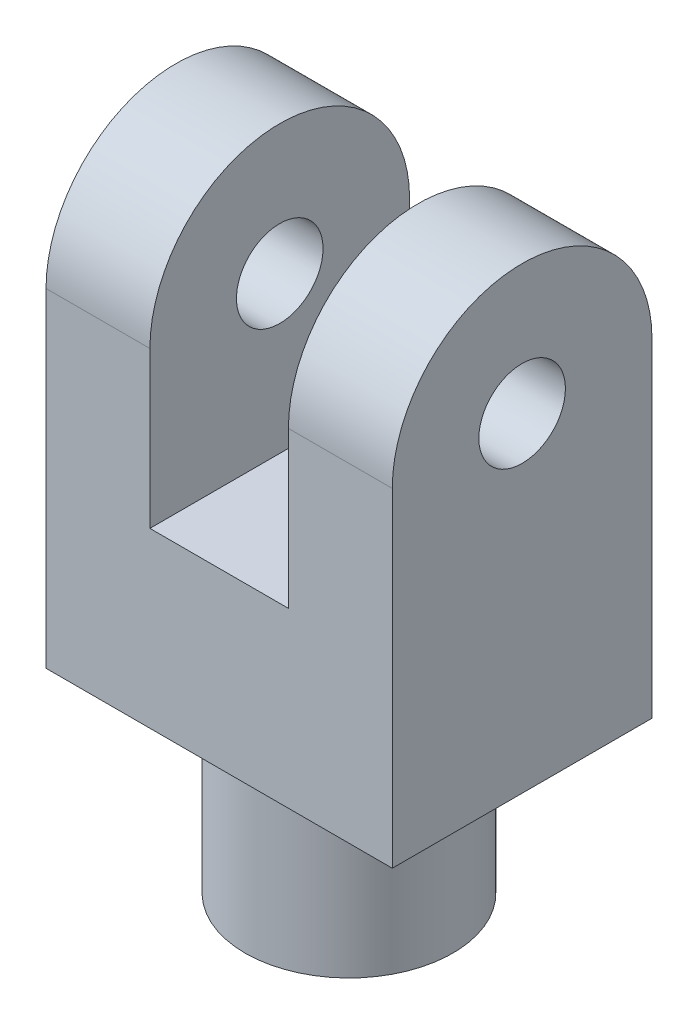
ISO-10303-21;
HEADER;
FILE_DESCRIPTION(('STEP AP214'),'2;1');
FILE_NAME('part.step','',(''),(''),'','','');
FILE_SCHEMA(('AUTOMOTIVE_DESIGN { 1 0 10303 214 1 1 1 1 }'));
ENDSEC;
DATA;
#1=APPLICATION_CONTEXT('core data for automotive mechanical design processes');
#2=APPLICATION_PROTOCOL_DEFINITION('international standard','automotive_design',2000,#1);
#3=PRODUCT_CONTEXT('',#1,'mechanical');
#4=PRODUCT('Part','Part','',(#3));
#5=PRODUCT_RELATED_PRODUCT_CATEGORY('part','',(#4));
#6=PRODUCT_DEFINITION_FORMATION('','',#4);
#7=PRODUCT_DEFINITION_CONTEXT('part definition',#1,'design');
#8=PRODUCT_DEFINITION('design','',#6,#7);
#9=PRODUCT_DEFINITION_SHAPE('','',#8);
#10=(LENGTH_UNIT() NAMED_UNIT(*) SI_UNIT(.MILLI.,.METRE.));
#11=(NAMED_UNIT(*) PLANE_ANGLE_UNIT() SI_UNIT($,.RADIAN.));
#12=(NAMED_UNIT(*) SI_UNIT($,.STERADIAN.) SOLID_ANGLE_UNIT());
#13=UNCERTAINTY_MEASURE_WITH_UNIT(LENGTH_MEASURE(1.E-05),#10,'distance_accuracy_value','');
#14=(GEOMETRIC_REPRESENTATION_CONTEXT(3) GLOBAL_UNCERTAINTY_ASSIGNED_CONTEXT((#13)) GLOBAL_UNIT_ASSIGNED_CONTEXT((#10,
#11,#12)) REPRESENTATION_CONTEXT('',''));
#15=CARTESIAN_POINT('',(0.,0.,0.));
#16=DIRECTION('',(0.,0.,1.));
#17=DIRECTION('',(1.,0.,0.));
#18=AXIS2_PLACEMENT_3D('',#15,#16,#17);
#19=CARTESIAN_POINT('',(20.,58.,-15.));
#20=DIRECTION('',(0.,0.,1.));
#21=DIRECTION('',(1.,0.,0.));
#22=AXIS2_PLACEMENT_3D('',#19,#20,#21);
#23=PLANE('',#22);
#24=DIRECTION('',(0.,-1.,0.));
#25=VECTOR('',#24,1.);
#26=CARTESIAN_POINT('',(-8.,83.,-15.));
#27=LINE('',#26,#25);
#28=CARTESIAN_POINT('',(-8.,58.,-15.));
#29=VERTEX_POINT('',#28);
#30=CARTESIAN_POINT('',(-8.,40.,-15.));
#31=VERTEX_POINT('',#30);
#32=EDGE_CURVE('E162',#29,#31,#27,.T.);
#33=ORIENTED_EDGE('',*,*,#32,.T.);
#34=DIRECTION('',(1.,0.,0.));
#35=VECTOR('',#34,1.);
#36=CARTESIAN_POINT('',(-8.,40.,-15.));
#37=LINE('',#36,#35);
#38=CARTESIAN_POINT('',(8.,40.,-15.));
#39=VERTEX_POINT('',#38);
#40=EDGE_CURVE('E141',#31,#39,#37,.T.);
#41=ORIENTED_EDGE('',*,*,#40,.T.);
#42=DIRECTION('',(0.,1.,0.));
#43=VECTOR('',#42,1.);
#44=CARTESIAN_POINT('',(8.,40.,-15.));
#45=LINE('',#44,#43);
#46=CARTESIAN_POINT('',(8.,58.,-15.));
#47=VERTEX_POINT('',#46);
#48=EDGE_CURVE('E149',#39,#47,#45,.T.);
#49=ORIENTED_EDGE('',*,*,#48,.T.);
#50=DIRECTION('',(-1.,0.,0.));
#51=VECTOR('',#50,1.);
#52=CARTESIAN_POINT('',(20.,58.,-15.));
#53=LINE('',#52,#51);
#54=CARTESIAN_POINT('',(20.,58.,-15.));
#55=VERTEX_POINT('',#54);
#56=EDGE_CURVE('E61',#55,#47,#53,.T.);
#57=ORIENTED_EDGE('',*,*,#56,.F.);
#58=DIRECTION('',(0.,1.,0.));
#59=VECTOR('',#58,1.);
#60=CARTESIAN_POINT('',(20.,58.,-15.));
#61=LINE('',#60,#59);
#62=CARTESIAN_POINT('',(20.,20.,-15.));
#63=VERTEX_POINT('',#62);
#64=EDGE_CURVE('E182',#63,#55,#61,.T.);
#65=ORIENTED_EDGE('',*,*,#64,.F.);
#66=DIRECTION('',(-1.,0.,0.));
#67=VECTOR('',#66,1.);
#68=CARTESIAN_POINT('',(20.,20.,-15.));
#69=LINE('',#68,#67);
#70=CARTESIAN_POINT('',(-20.,20.,-15.));
#71=VERTEX_POINT('',#70);
#72=EDGE_CURVE('E191',#63,#71,#69,.T.);
#73=ORIENTED_EDGE('',*,*,#72,.T.);
#74=DIRECTION('',(0.,1.,0.));
#75=VECTOR('',#74,1.);
#76=CARTESIAN_POINT('',(-20.,58.,-15.));
#77=LINE('',#76,#75);
#78=CARTESIAN_POINT('',(-20.,58.,-15.));
#79=VERTEX_POINT('',#78);
#80=EDGE_CURVE('E178',#71,#79,#77,.T.);
#81=ORIENTED_EDGE('',*,*,#80,.T.);
#82=EDGE_CURVE('E213',#29,#79,#53,.T.);
#83=ORIENTED_EDGE('',*,*,#82,.F.);
#84=EDGE_LOOP('',(#33,#41,#49,#57,#65,#73,#81,#83));
#85=FACE_BOUND('',#84,.T.);
#86=ADVANCED_FACE('F51',(#85),#23,.F.);
#87=CARTESIAN_POINT('',(20.,58.,0.));
#88=DIRECTION('',(-1.,0.,0.));
#89=DIRECTION('',(0.,0.,1.));
#90=AXIS2_PLACEMENT_3D('',#87,#88,#89);
#91=CYLINDRICAL_SURFACE('',#90,15.);
#92=CARTESIAN_POINT('',(-8.,58.,0.));
#93=DIRECTION('',(1.,0.,0.));
#94=DIRECTION('',(0.,0.,-1.));
#95=AXIS2_PLACEMENT_3D('',#92,#93,#94);
#96=CIRCLE('',#95,15.);
#97=CARTESIAN_POINT('',(-8.,58.,15.));
#98=VERTEX_POINT('',#97);
#99=EDGE_CURVE('E132',#29,#98,#96,.T.);
#100=ORIENTED_EDGE('',*,*,#99,.F.);
#101=ORIENTED_EDGE('',*,*,#82,.T.);
#102=CARTESIAN_POINT('',(-20.,58.,0.));
#103=DIRECTION('',(1.,0.,0.));
#104=DIRECTION('',(0.,0.,1.));
#105=AXIS2_PLACEMENT_3D('',#102,#103,#104);
#106=CIRCLE('',#105,15.);
#107=CARTESIAN_POINT('',(-20.,58.,15.));
#108=VERTEX_POINT('',#107);
#109=EDGE_CURVE('E195',#79,#108,#106,.T.);
#110=ORIENTED_EDGE('',*,*,#109,.T.);
#111=DIRECTION('',(-1.,0.,0.));
#112=VECTOR('',#111,1.);
#113=CARTESIAN_POINT('',(20.,58.,15.));
#114=LINE('',#113,#112);
#115=EDGE_CURVE('E209',#98,#108,#114,.T.);
#116=ORIENTED_EDGE('',*,*,#115,.F.);
#117=EDGE_LOOP('',(#100,#101,#110,#116));
#118=FACE_BOUND('',#117,.T.);
#119=ADVANCED_FACE('F221',(#118),#91,.T.);
#120=CARTESIAN_POINT('',(8.,58.,0.));
#121=DIRECTION('',(-1.,0.,0.));
#122=DIRECTION('',(0.,0.,1.));
#123=AXIS2_PLACEMENT_3D('',#120,#121,#122);
#124=CIRCLE('',#123,15.);
#125=CARTESIAN_POINT('',(8.,58.,15.));
#126=VERTEX_POINT('',#125);
#127=EDGE_CURVE('E143',#126,#47,#124,.T.);
#128=ORIENTED_EDGE('',*,*,#127,.F.);
#129=CARTESIAN_POINT('',(20.,58.,15.));
#130=VERTEX_POINT('',#129);
#131=EDGE_CURVE('E210',#130,#126,#114,.T.);
#132=ORIENTED_EDGE('',*,*,#131,.F.);
#133=CARTESIAN_POINT('',(20.,58.,0.));
#134=DIRECTION('',(1.,0.,0.));
#135=DIRECTION('',(0.,0.,1.));
#136=AXIS2_PLACEMENT_3D('',#133,#134,#135);
#137=CIRCLE('',#136,15.);
#138=EDGE_CURVE('E106',#55,#130,#137,.T.);
#139=ORIENTED_EDGE('',*,*,#138,.F.);
#140=ORIENTED_EDGE('',*,*,#56,.T.);
#141=EDGE_LOOP('',(#128,#132,#139,#140));
#142=FACE_BOUND('',#141,.T.);
#143=ADVANCED_FACE('F260',(#142),#91,.T.);
#144=CARTESIAN_POINT('',(20.,20.,15.));
#145=DIRECTION('',(0.,0.,-1.));
#146=DIRECTION('',(-1.,0.,0.));
#147=AXIS2_PLACEMENT_3D('',#144,#145,#146);
#148=PLANE('',#147);
#149=DIRECTION('',(0.,-1.,0.));
#150=VECTOR('',#149,1.);
#151=CARTESIAN_POINT('',(-8.,20.,15.));
#152=LINE('',#151,#150);
#153=CARTESIAN_POINT('',(-8.,40.,15.));
#154=VERTEX_POINT('',#153);
#155=EDGE_CURVE('E11',#98,#154,#152,.T.);
#156=ORIENTED_EDGE('',*,*,#155,.F.);
#157=ORIENTED_EDGE('',*,*,#115,.T.);
#158=DIRECTION('',(0.,-1.,0.));
#159=VECTOR('',#158,1.);
#160=CARTESIAN_POINT('',(-20.,20.,15.));
#161=LINE('',#160,#159);
#162=CARTESIAN_POINT('',(-20.,20.,15.));
#163=VERTEX_POINT('',#162);
#164=EDGE_CURVE('E199',#108,#163,#161,.T.);
#165=ORIENTED_EDGE('',*,*,#164,.T.);
#166=DIRECTION('',(-1.,0.,0.));
#167=VECTOR('',#166,1.);
#168=CARTESIAN_POINT('',(20.,20.,15.));
#169=LINE('',#168,#167);
#170=CARTESIAN_POINT('',(20.,20.,15.));
#171=VERTEX_POINT('',#170);
#172=EDGE_CURVE('E206',#171,#163,#169,.T.);
#173=ORIENTED_EDGE('',*,*,#172,.F.);
#174=DIRECTION('',(0.,-1.,0.));
#175=VECTOR('',#174,1.);
#176=CARTESIAN_POINT('',(20.,20.,15.));
#177=LINE('',#176,#175);
#178=EDGE_CURVE('E186',#130,#171,#177,.T.);
#179=ORIENTED_EDGE('',*,*,#178,.F.);
#180=ORIENTED_EDGE('',*,*,#131,.T.);
#181=DIRECTION('',(0.,1.,0.));
#182=VECTOR('',#181,1.);
#183=CARTESIAN_POINT('',(8.,40.,15.));
#184=LINE('',#183,#182);
#185=CARTESIAN_POINT('',(8.,40.,15.));
#186=VERTEX_POINT('',#185);
#187=EDGE_CURVE('E147',#186,#126,#184,.T.);
#188=ORIENTED_EDGE('',*,*,#187,.F.);
#189=DIRECTION('',(1.,0.,0.));
#190=VECTOR('',#189,1.);
#191=CARTESIAN_POINT('',(-8.,40.,15.));
#192=LINE('',#191,#190);
#193=EDGE_CURVE('E138',#154,#186,#192,.T.);
#194=ORIENTED_EDGE('',*,*,#193,.F.);
#195=EDGE_LOOP('',(#156,#157,#165,#173,#179,#180,#188,#194));
#196=FACE_BOUND('',#195,.T.);
#197=ADVANCED_FACE('F145',(#196),#148,.F.);
#198=CARTESIAN_POINT('',(20.,20.,-15.));
#199=DIRECTION('',(0.,1.,0.));
#200=DIRECTION('',(0.,0.,1.));
#201=AXIS2_PLACEMENT_3D('',#198,#199,#200);
#202=PLANE('',#201);
#203=CARTESIAN_POINT('',(0.,20.,0.));
#204=DIRECTION('',(0.,1.,0.));
#205=DIRECTION('',(0.,0.,1.));
#206=AXIS2_PLACEMENT_3D('',#203,#204,#205);
#207=CIRCLE('',#206,12.);
#208=CARTESIAN_POINT('',(0.,20.,12.));
#209=VERTEX_POINT('',#208);
#210=EDGE_CURVE('E174',#209,#209,#207,.T.);
#211=ORIENTED_EDGE('',*,*,#210,.T.);
#212=EDGE_LOOP('',(#211));
#213=FACE_BOUND('',#212,.T.);
#214=DIRECTION('',(0.,0.,-1.));
#215=VECTOR('',#214,1.);
#216=CARTESIAN_POINT('',(-20.,20.,-15.));
#217=LINE('',#216,#215);
#218=EDGE_CURVE('E98',#163,#71,#217,.T.);
#219=ORIENTED_EDGE('',*,*,#218,.T.);
#220=ORIENTED_EDGE('',*,*,#72,.F.);
#221=DIRECTION('',(0.,0.,-1.));
#222=VECTOR('',#221,1.);
#223=CARTESIAN_POINT('',(20.,20.,-15.));
#224=LINE('',#223,#222);
#225=EDGE_CURVE('E77',#171,#63,#224,.T.);
#226=ORIENTED_EDGE('',*,*,#225,.F.);
#227=ORIENTED_EDGE('',*,*,#172,.T.);
#228=EDGE_LOOP('',(#219,#220,#226,#227));
#229=FACE_BOUND('',#228,.T.);
#230=ADVANCED_FACE('F228',(#213,#229),#202,.F.);
#231=CARTESIAN_POINT('',(20.,58.,0.));
#232=DIRECTION('',(-1.,0.,0.));
#233=DIRECTION('',(0.,0.,1.));
#234=AXIS2_PLACEMENT_3D('',#231,#232,#233);
#235=PLANE('',#234);
#236=CARTESIAN_POINT('',(20.,58.,0.));
#237=DIRECTION('',(1.,0.,0.));
#238=DIRECTION('',(0.,0.,-1.));
#239=AXIS2_PLACEMENT_3D('',#236,#237,#238);
#240=CIRCLE('',#239,5.);
#241=CARTESIAN_POINT('',(20.,58.,-5.));
#242=VERTEX_POINT('',#241);
#243=EDGE_CURVE('E236',#242,#242,#240,.T.);
#244=ORIENTED_EDGE('',*,*,#243,.F.);
#245=EDGE_LOOP('',(#244));
#246=FACE_BOUND('',#245,.T.);
#247=ORIENTED_EDGE('',*,*,#64,.T.);
#248=ORIENTED_EDGE('',*,*,#138,.T.);
#249=ORIENTED_EDGE('',*,*,#178,.T.);
#250=ORIENTED_EDGE('',*,*,#225,.T.);
#251=EDGE_LOOP('',(#247,#248,#249,#250));
#252=FACE_BOUND('',#251,.T.);
#253=ADVANCED_FACE('F256',(#246,#252),#235,.F.);
#254=CARTESIAN_POINT('',(-20.,58.,0.));
#255=DIRECTION('',(-1.,0.,0.));
#256=DIRECTION('',(0.,0.,1.));
#257=AXIS2_PLACEMENT_3D('',#254,#255,#256);
#258=PLANE('',#257);
#259=CARTESIAN_POINT('',(-20.,58.,0.));
#260=DIRECTION('',(1.,0.,0.));
#261=DIRECTION('',(0.,0.,-1.));
#262=AXIS2_PLACEMENT_3D('',#259,#260,#261);
#263=CIRCLE('',#262,5.);
#264=CARTESIAN_POINT('',(-20.,58.,-5.));
#265=VERTEX_POINT('',#264);
#266=EDGE_CURVE('E241',#265,#265,#263,.T.);
#267=ORIENTED_EDGE('',*,*,#266,.T.);
#268=EDGE_LOOP('',(#267));
#269=FACE_BOUND('',#268,.T.);
#270=ORIENTED_EDGE('',*,*,#80,.F.);
#271=ORIENTED_EDGE('',*,*,#218,.F.);
#272=ORIENTED_EDGE('',*,*,#164,.F.);
#273=ORIENTED_EDGE('',*,*,#109,.F.);
#274=EDGE_LOOP('',(#270,#271,#272,#273));
#275=FACE_BOUND('',#274,.T.);
#276=ADVANCED_FACE('F226',(#269,#275),#258,.T.);
#277=CARTESIAN_POINT('',(0.,20.,0.));
#278=DIRECTION('',(0.,-1.,0.));
#279=DIRECTION('',(0.,0.,-1.));
#280=AXIS2_PLACEMENT_3D('',#277,#278,#279);
#281=CYLINDRICAL_SURFACE('',#280,12.);
#282=ORIENTED_EDGE('',*,*,#210,.F.);
#283=EDGE_LOOP('',(#282));
#284=FACE_BOUND('',#283,.T.);
#285=CARTESIAN_POINT('',(0.,0.,0.));
#286=DIRECTION('',(0.,1.,0.));
#287=DIRECTION('',(0.,0.,1.));
#288=AXIS2_PLACEMENT_3D('',#285,#286,#287);
#289=CIRCLE('',#288,12.);
#290=CARTESIAN_POINT('',(0.,0.,12.));
#291=VERTEX_POINT('',#290);
#292=EDGE_CURVE('E173',#291,#291,#289,.T.);
#293=ORIENTED_EDGE('',*,*,#292,.T.);
#294=EDGE_LOOP('',(#293));
#295=FACE_BOUND('',#294,.T.);
#296=ADVANCED_FACE('F298',(#284,#295),#281,.T.);
#297=CARTESIAN_POINT('',(0.,0.,0.));
#298=DIRECTION('',(0.,1.,0.));
#299=DIRECTION('',(0.,0.,1.));
#300=AXIS2_PLACEMENT_3D('',#297,#298,#299);
#301=PLANE('',#300);
#302=CARTESIAN_POINT('',(0.,0.,0.));
#303=DIRECTION('',(0.,1.,0.));
#304=DIRECTION('',(0.,0.,1.));
#305=AXIS2_PLACEMENT_3D('',#302,#303,#304);
#306=CIRCLE('',#305,6.);
#307=CARTESIAN_POINT('',(0.,0.,6.));
#308=VERTEX_POINT('',#307);
#309=EDGE_CURVE('E242',#308,#308,#306,.T.);
#310=ORIENTED_EDGE('',*,*,#309,.T.);
#311=EDGE_LOOP('',(#310));
#312=FACE_BOUND('',#311,.T.);
#313=ORIENTED_EDGE('',*,*,#292,.F.);
#314=EDGE_LOOP('',(#313));
#315=FACE_BOUND('',#314,.T.);
#316=ADVANCED_FACE('F305',(#312,#315),#301,.F.);
#317=CARTESIAN_POINT('',(-8.,83.,15.));
#318=DIRECTION('',(1.,0.,0.));
#319=DIRECTION('',(0.,0.,-1.));
#320=AXIS2_PLACEMENT_3D('',#317,#318,#319);
#321=PLANE('',#320);
#322=CARTESIAN_POINT('',(-8.,58.,0.));
#323=DIRECTION('',(1.,0.,0.));
#324=DIRECTION('',(0.,0.,-1.));
#325=AXIS2_PLACEMENT_3D('',#322,#323,#324);
#326=CIRCLE('',#325,5.);
#327=CARTESIAN_POINT('',(-8.,58.,-5.));
#328=VERTEX_POINT('',#327);
#329=EDGE_CURVE('E159',#328,#328,#326,.F.);
#330=ORIENTED_EDGE('',*,*,#329,.T.);
#331=EDGE_LOOP('',(#330));
#332=FACE_BOUND('',#331,.T.);
#333=ORIENTED_EDGE('',*,*,#99,.T.);
#334=ORIENTED_EDGE('',*,*,#155,.T.);
#335=DIRECTION('',(0.,0.,-1.));
#336=VECTOR('',#335,1.);
#337=CARTESIAN_POINT('',(-8.,40.,15.));
#338=LINE('',#337,#336);
#339=EDGE_CURVE('E129',#154,#31,#338,.T.);
#340=ORIENTED_EDGE('',*,*,#339,.T.);
#341=ORIENTED_EDGE('',*,*,#32,.F.);
#342=EDGE_LOOP('',(#333,#334,#340,#341));
#343=FACE_BOUND('',#342,.T.);
#344=ADVANCED_FACE('F128',(#332,#343),#321,.T.);
#345=CARTESIAN_POINT('',(8.,40.,15.));
#346=DIRECTION('',(-1.,0.,0.));
#347=DIRECTION('',(0.,0.,1.));
#348=AXIS2_PLACEMENT_3D('',#345,#346,#347);
#349=PLANE('',#348);
#350=CARTESIAN_POINT('',(8.,58.,0.));
#351=DIRECTION('',(-1.,0.,0.));
#352=DIRECTION('',(0.,0.,1.));
#353=AXIS2_PLACEMENT_3D('',#350,#351,#352);
#354=CIRCLE('',#353,5.);
#355=CARTESIAN_POINT('',(8.,58.,5.));
#356=VERTEX_POINT('',#355);
#357=EDGE_CURVE('E55',#356,#356,#354,.F.);
#358=ORIENTED_EDGE('',*,*,#357,.T.);
#359=EDGE_LOOP('',(#358));
#360=FACE_BOUND('',#359,.T.);
#361=ORIENTED_EDGE('',*,*,#127,.T.);
#362=ORIENTED_EDGE('',*,*,#48,.F.);
#363=DIRECTION('',(0.,0.,-1.));
#364=VECTOR('',#363,1.);
#365=CARTESIAN_POINT('',(8.,40.,15.));
#366=LINE('',#365,#364);
#367=EDGE_CURVE('E68',#186,#39,#366,.T.);
#368=ORIENTED_EDGE('',*,*,#367,.F.);
#369=ORIENTED_EDGE('',*,*,#187,.T.);
#370=EDGE_LOOP('',(#361,#362,#368,#369));
#371=FACE_BOUND('',#370,.T.);
#372=ADVANCED_FACE('F259',(#360,#371),#349,.T.);
#373=CARTESIAN_POINT('',(-8.,40.,15.));
#374=DIRECTION('',(0.,1.,0.));
#375=DIRECTION('',(0.,0.,1.));
#376=AXIS2_PLACEMENT_3D('',#373,#374,#375);
#377=PLANE('',#376);
#378=ORIENTED_EDGE('',*,*,#40,.F.);
#379=ORIENTED_EDGE('',*,*,#339,.F.);
#380=ORIENTED_EDGE('',*,*,#193,.T.);
#381=ORIENTED_EDGE('',*,*,#367,.T.);
#382=EDGE_LOOP('',(#378,#379,#380,#381));
#383=FACE_BOUND('',#382,.T.);
#384=ADVANCED_FACE('F137',(#383),#377,.T.);
#385=CARTESIAN_POINT('',(20.,58.,0.));
#386=DIRECTION('',(-1.,0.,0.));
#387=DIRECTION('',(0.,0.,1.));
#388=AXIS2_PLACEMENT_3D('',#385,#386,#387);
#389=CYLINDRICAL_SURFACE('',#388,5.);
#390=ORIENTED_EDGE('',*,*,#357,.F.);
#391=EDGE_LOOP('',(#390));
#392=FACE_BOUND('',#391,.T.);
#393=ORIENTED_EDGE('',*,*,#243,.T.);
#394=EDGE_LOOP('',(#393));
#395=FACE_BOUND('',#394,.T.);
#396=ADVANCED_FACE('F254',(#392,#395),#389,.F.);
#397=ORIENTED_EDGE('',*,*,#329,.F.);
#398=EDGE_LOOP('',(#397));
#399=FACE_BOUND('',#398,.T.);
#400=ORIENTED_EDGE('',*,*,#266,.F.);
#401=EDGE_LOOP('',(#400));
#402=FACE_BOUND('',#401,.T.);
#403=ADVANCED_FACE('F340',(#399,#402),#389,.F.);
#404=CARTESIAN_POINT('',(0.,16.,0.));
#405=DIRECTION('',(0.,-1.,0.));
#406=DIRECTION('',(0.,0.,-1.));
#407=AXIS2_PLACEMENT_3D('',#404,#405,#406);
#408=CYLINDRICAL_SURFACE('',#407,6.);
#409=CARTESIAN_POINT('',(0.,16.,0.));
#410=DIRECTION('',(0.,1.,0.));
#411=DIRECTION('',(0.,0.,1.));
#412=AXIS2_PLACEMENT_3D('',#409,#410,#411);
#413=CIRCLE('',#412,6.);
#414=CARTESIAN_POINT('',(0.,16.,6.));
#415=VERTEX_POINT('',#414);
#416=EDGE_CURVE('E238',#415,#415,#413,.T.);
#417=ORIENTED_EDGE('',*,*,#416,.T.);
#418=EDGE_LOOP('',(#417));
#419=FACE_BOUND('',#418,.T.);
#420=ORIENTED_EDGE('',*,*,#309,.F.);
#421=EDGE_LOOP('',(#420));
#422=FACE_BOUND('',#421,.T.);
#423=ADVANCED_FACE('F347',(#419,#422),#408,.F.);
#424=CARTESIAN_POINT('',(0.,16.,0.));
#425=DIRECTION('',(0.,1.,0.));
#426=DIRECTION('',(0.,0.,1.));
#427=AXIS2_PLACEMENT_3D('',#424,#425,#426);
#428=PLANE('',#427);
#429=ORIENTED_EDGE('',*,*,#416,.F.);
#430=EDGE_LOOP('',(#429));
#431=FACE_BOUND('',#430,.T.);
#432=ADVANCED_FACE('F353',(#431),#428,.F.);
#433=CLOSED_SHELL('',(#86,#119,#143,#197,#230,#253,#276,#296,#316,#344,#372,#384,#396,#403,#423,#432));
#434=MANIFOLD_SOLID_BREP('B2',#433);
#435=ADVANCED_BREP_SHAPE_REPRESENTATION('',(#18,#434),#14);
#436=SHAPE_DEFINITION_REPRESENTATION(#9,#435);
ENDSEC;
END-ISO-10303-21;
